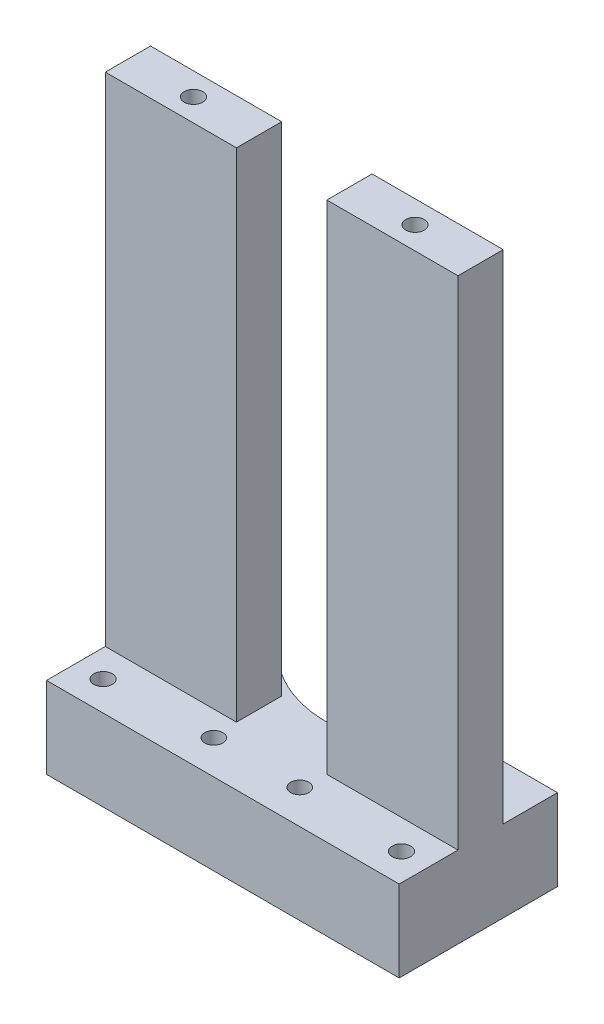
ISO-10303-21;
HEADER;
FILE_DESCRIPTION(('STEP AP214'),'2;1');
FILE_NAME('part.step','',(''),(''),'','','');
FILE_SCHEMA(('AUTOMOTIVE_DESIGN { 1 0 10303 214 1 1 1 1 }'));
ENDSEC;
DATA;
#1=APPLICATION_CONTEXT('core data for automotive mechanical design processes');
#2=APPLICATION_PROTOCOL_DEFINITION('international standard','automotive_design',2000,#1);
#3=PRODUCT_CONTEXT('',#1,'mechanical');
#4=PRODUCT('Part','Part','',(#3));
#5=PRODUCT_RELATED_PRODUCT_CATEGORY('part','',(#4));
#6=PRODUCT_DEFINITION_FORMATION('','',#4);
#7=PRODUCT_DEFINITION_CONTEXT('part definition',#1,'design');
#8=PRODUCT_DEFINITION('design','',#6,#7);
#9=PRODUCT_DEFINITION_SHAPE('','',#8);
#10=(LENGTH_UNIT() NAMED_UNIT(*) SI_UNIT(.MILLI.,.METRE.));
#11=(NAMED_UNIT(*) PLANE_ANGLE_UNIT() SI_UNIT($,.RADIAN.));
#12=(NAMED_UNIT(*) SI_UNIT($,.STERADIAN.) SOLID_ANGLE_UNIT());
#13=UNCERTAINTY_MEASURE_WITH_UNIT(LENGTH_MEASURE(1.E-05),#10,'distance_accuracy_value','');
#14=(GEOMETRIC_REPRESENTATION_CONTEXT(3) GLOBAL_UNCERTAINTY_ASSIGNED_CONTEXT((#13)) GLOBAL_UNIT_ASSIGNED_CONTEXT((#10,
#11,#12)) REPRESENTATION_CONTEXT('',''));
#15=CARTESIAN_POINT('',(0.,0.,0.));
#16=DIRECTION('',(0.,0.,1.));
#17=DIRECTION('',(1.,0.,0.));
#18=AXIS2_PLACEMENT_3D('',#15,#16,#17);
#19=CARTESIAN_POINT('',(0.,18.,-29.1666666666667));
#20=DIRECTION('',(0.,1.,0.));
#21=DIRECTION('',(0.,0.,1.));
#22=AXIS2_PLACEMENT_3D('',#19,#20,#21);
#23=PLANE('',#22);
#24=CARTESIAN_POINT('',(-33.,18.,13.5));
#25=DIRECTION('',(0.,1.,0.));
#26=DIRECTION('',(0.,0.,1.));
#27=AXIS2_PLACEMENT_3D('',#24,#25,#26);
#28=CIRCLE('',#27,2.05);
#29=CARTESIAN_POINT('',(-33.,18.,15.55));
#30=VERTEX_POINT('',#29);
#31=EDGE_CURVE('E271',#30,#30,#28,.T.);
#32=ORIENTED_EDGE('',*,*,#31,.F.);
#33=EDGE_LOOP('',(#32));
#34=FACE_BOUND('',#33,.T.);
#35=CARTESIAN_POINT('',(33.0000000000001,18.,13.4999999999998));
#36=DIRECTION('',(0.,1.,0.));
#37=DIRECTION('',(0.,0.,-1.));
#38=AXIS2_PLACEMENT_3D('',#35,#36,#37);
#39=CIRCLE('',#38,2.05);
#40=CARTESIAN_POINT('',(33.0000000000001,18.,11.4499999999998));
#41=VERTEX_POINT('',#40);
#42=EDGE_CURVE('E257',#41,#41,#39,.T.);
#43=ORIENTED_EDGE('',*,*,#42,.F.);
#44=EDGE_LOOP('',(#43));
#45=FACE_BOUND('',#44,.T.);
#46=CARTESIAN_POINT('',(29.,18.,-8.));
#47=DIRECTION('',(0.,1.,0.));
#48=DIRECTION('',(0.,0.,1.));
#49=AXIS2_PLACEMENT_3D('',#46,#47,#48);
#50=CIRCLE('',#49,2.);
#51=CARTESIAN_POINT('',(29.,18.,-6.));
#52=VERTEX_POINT('',#51);
#53=EDGE_CURVE('E345',#52,#52,#50,.T.);
#54=ORIENTED_EDGE('',*,*,#53,.F.);
#55=EDGE_LOOP('',(#54));
#56=FACE_BOUND('',#55,.T.);
#57=CARTESIAN_POINT('',(-29.,18.,-8.));
#58=DIRECTION('',(0.,1.,0.));
#59=DIRECTION('',(0.,0.,1.));
#60=AXIS2_PLACEMENT_3D('',#57,#58,#59);
#61=CIRCLE('',#60,2.);
#62=CARTESIAN_POINT('',(-29.,18.,-6.));
#63=VERTEX_POINT('',#62);
#64=EDGE_CURVE('E357',#63,#63,#61,.T.);
#65=ORIENTED_EDGE('',*,*,#64,.F.);
#66=EDGE_LOOP('',(#65));
#67=FACE_BOUND('',#66,.T.);
#68=CARTESIAN_POINT('',(-9.50000000000001,18.,12.5));
#69=DIRECTION('',(0.,1.,0.));
#70=DIRECTION('',(0.,0.,1.));
#71=AXIS2_PLACEMENT_3D('',#68,#69,#70);
#72=CIRCLE('',#71,2.);
#73=CARTESIAN_POINT('',(-9.50000000000001,18.,14.5));
#74=VERTEX_POINT('',#73);
#75=EDGE_CURVE('E351',#74,#74,#72,.T.);
#76=ORIENTED_EDGE('',*,*,#75,.F.);
#77=EDGE_LOOP('',(#76));
#78=FACE_BOUND('',#77,.T.);
#79=CARTESIAN_POINT('',(9.49999999999999,18.,12.5));
#80=DIRECTION('',(0.,1.,0.));
#81=DIRECTION('',(0.,0.,1.));
#82=AXIS2_PLACEMENT_3D('',#79,#80,#81);
#83=CIRCLE('',#82,2.);
#84=CARTESIAN_POINT('',(9.49999999999999,18.,14.5));
#85=VERTEX_POINT('',#84);
#86=EDGE_CURVE('E339',#85,#85,#83,.T.);
#87=ORIENTED_EDGE('',*,*,#86,.F.);
#88=EDGE_LOOP('',(#87));
#89=FACE_BOUND('',#88,.T.);
#90=DIRECTION('',(0.,0.,-1.));
#91=VECTOR('',#90,1.);
#92=CARTESIAN_POINT('',(39.,18.,-15.));
#93=LINE('',#92,#91);
#94=CARTESIAN_POINT('',(39.,18.,20.));
#95=VERTEX_POINT('',#94);
#96=CARTESIAN_POINT('',(39.,18.,6.99999999999995));
#97=VERTEX_POINT('',#96);
#98=EDGE_CURVE('E377',#95,#97,#93,.T.);
#99=ORIENTED_EDGE('',*,*,#98,.T.);
#100=DIRECTION('',(1.,0.,0.));
#101=VECTOR('',#100,1.);
#102=CARTESIAN_POINT('',(10.,18.,6.99999999999995));
#103=LINE('',#102,#101);
#104=CARTESIAN_POINT('',(10.,18.,6.99999999999995));
#105=VERTEX_POINT('',#104);
#106=EDGE_CURVE('E292',#105,#97,#103,.T.);
#107=ORIENTED_EDGE('',*,*,#106,.F.);
#108=DIRECTION('',(0.,0.,1.));
#109=VECTOR('',#108,1.);
#110=CARTESIAN_POINT('',(9.99999999999998,18.,-3.00000000000005));
#111=LINE('',#110,#109);
#112=CARTESIAN_POINT('',(9.99999999999998,18.,-3.00000000000005));
#113=VERTEX_POINT('',#112);
#114=EDGE_CURVE('E270',#113,#105,#111,.T.);
#115=ORIENTED_EDGE('',*,*,#114,.F.);
#116=DIRECTION('',(-1.,0.,0.));
#117=VECTOR('',#116,1.);
#118=CARTESIAN_POINT('',(39.,18.,-3.00000000000019));
#119=LINE('',#118,#117);
#120=CARTESIAN_POINT('',(39.,18.,-3.00000000000019));
#121=VERTEX_POINT('',#120);
#122=EDGE_CURVE('E283',#121,#113,#119,.T.);
#123=ORIENTED_EDGE('',*,*,#122,.F.);
#124=CARTESIAN_POINT('',(39.,18.,-15.));
#125=VERTEX_POINT('',#124);
#126=EDGE_CURVE('E376',#121,#125,#93,.T.);
#127=ORIENTED_EDGE('',*,*,#126,.T.);
#128=DIRECTION('',(-1.,0.,0.));
#129=VECTOR('',#128,1.);
#130=CARTESIAN_POINT('',(22.,18.,-15.));
#131=LINE('',#130,#129);
#132=CARTESIAN_POINT('',(22.,18.,-15.));
#133=VERTEX_POINT('',#132);
#134=EDGE_CURVE('E363',#125,#133,#131,.T.);
#135=ORIENTED_EDGE('',*,*,#134,.T.);
#136=CARTESIAN_POINT('',(0.,18.,-29.1666666666667));
#137=DIRECTION('',(0.,-1.,0.));
#138=DIRECTION('',(0.,0.,1.));
#139=AXIS2_PLACEMENT_3D('',#136,#137,#138);
#140=CIRCLE('',#139,26.1666666666667);
#141=CARTESIAN_POINT('',(-22.,18.,-15.));
#142=VERTEX_POINT('',#141);
#143=EDGE_CURVE('E366',#133,#142,#140,.T.);
#144=ORIENTED_EDGE('',*,*,#143,.T.);
#145=DIRECTION('',(-1.,0.,0.));
#146=VECTOR('',#145,1.);
#147=CARTESIAN_POINT('',(-39.,18.,-15.));
#148=LINE('',#147,#146);
#149=CARTESIAN_POINT('',(-39.,18.,-15.));
#150=VERTEX_POINT('',#149);
#151=EDGE_CURVE('E369',#142,#150,#148,.T.);
#152=ORIENTED_EDGE('',*,*,#151,.T.);
#153=DIRECTION('',(0.,0.,1.));
#154=VECTOR('',#153,1.);
#155=CARTESIAN_POINT('',(-39.,18.,-15.));
#156=LINE('',#155,#154);
#157=CARTESIAN_POINT('',(-39.,18.,-3.));
#158=VERTEX_POINT('',#157);
#159=EDGE_CURVE('E372',#150,#158,#156,.T.);
#160=ORIENTED_EDGE('',*,*,#159,.T.);
#161=DIRECTION('',(-1.,0.,0.));
#162=VECTOR('',#161,1.);
#163=CARTESIAN_POINT('',(-39.,18.,-3.));
#164=LINE('',#163,#162);
#165=CARTESIAN_POINT('',(-10.,18.,-3.));
#166=VERTEX_POINT('',#165);
#167=EDGE_CURVE('E313',#166,#158,#164,.T.);
#168=ORIENTED_EDGE('',*,*,#167,.F.);
#169=DIRECTION('',(0.,0.,-1.));
#170=VECTOR('',#169,1.);
#171=CARTESIAN_POINT('',(-10.,18.,-3.));
#172=LINE('',#171,#170);
#173=CARTESIAN_POINT('',(-10.,18.,7.));
#174=VERTEX_POINT('',#173);
#175=EDGE_CURVE('E322',#174,#166,#172,.T.);
#176=ORIENTED_EDGE('',*,*,#175,.F.);
#177=DIRECTION('',(1.,0.,0.));
#178=VECTOR('',#177,1.);
#179=CARTESIAN_POINT('',(-10.,18.,7.));
#180=LINE('',#179,#178);
#181=CARTESIAN_POINT('',(-39.,18.,7.));
#182=VERTEX_POINT('',#181);
#183=EDGE_CURVE('E308',#182,#174,#180,.T.);
#184=ORIENTED_EDGE('',*,*,#183,.F.);
#185=CARTESIAN_POINT('',(-39.,18.,20.));
#186=VERTEX_POINT('',#185);
#187=EDGE_CURVE('E371',#182,#186,#156,.T.);
#188=ORIENTED_EDGE('',*,*,#187,.T.);
#189=DIRECTION('',(1.,0.,0.));
#190=VECTOR('',#189,1.);
#191=CARTESIAN_POINT('',(-39.,18.,20.));
#192=LINE('',#191,#190);
#193=EDGE_CURVE('E374',#186,#95,#192,.T.);
#194=ORIENTED_EDGE('',*,*,#193,.T.);
#195=EDGE_LOOP('',(#99,#107,#115,#123,#127,#135,#144,#152,#160,#168,#176,#184,#188,#194));
#196=FACE_BOUND('',#195,.T.);
#197=ADVANCED_FACE('F33',(#34,#45,#56,#67,#78,#89,#196),#23,.T.);
#198=CARTESIAN_POINT('',(0.,0.,-29.1666666666667));
#199=DIRECTION('',(0.,1.,0.));
#200=DIRECTION('',(0.,0.,1.));
#201=AXIS2_PLACEMENT_3D('',#198,#199,#200);
#202=PLANE('',#201);
#203=DIRECTION('',(-1.,0.,0.));
#204=VECTOR('',#203,1.);
#205=CARTESIAN_POINT('',(22.,0.,-15.));
#206=LINE('',#205,#204);
#207=CARTESIAN_POINT('',(39.,0.,-15.));
#208=VERTEX_POINT('',#207);
#209=CARTESIAN_POINT('',(22.,0.,-15.));
#210=VERTEX_POINT('',#209);
#211=EDGE_CURVE('E360',#208,#210,#206,.T.);
#212=ORIENTED_EDGE('',*,*,#211,.F.);
#213=DIRECTION('',(0.,0.,-1.));
#214=VECTOR('',#213,1.);
#215=CARTESIAN_POINT('',(39.,0.,-15.));
#216=LINE('',#215,#214);
#217=CARTESIAN_POINT('',(39.,0.,20.));
#218=VERTEX_POINT('',#217);
#219=EDGE_CURVE('E367',#218,#208,#216,.T.);
#220=ORIENTED_EDGE('',*,*,#219,.F.);
#221=DIRECTION('',(1.,0.,0.));
#222=VECTOR('',#221,1.);
#223=CARTESIAN_POINT('',(-39.,0.,20.));
#224=LINE('',#223,#222);
#225=CARTESIAN_POINT('',(-39.,0.,20.));
#226=VERTEX_POINT('',#225);
#227=EDGE_CURVE('E388',#226,#218,#224,.T.);
#228=ORIENTED_EDGE('',*,*,#227,.F.);
#229=DIRECTION('',(0.,0.,1.));
#230=VECTOR('',#229,1.);
#231=CARTESIAN_POINT('',(-39.,0.,-15.));
#232=LINE('',#231,#230);
#233=CARTESIAN_POINT('',(-39.,0.,-15.));
#234=VERTEX_POINT('',#233);
#235=EDGE_CURVE('E386',#234,#226,#232,.T.);
#236=ORIENTED_EDGE('',*,*,#235,.F.);
#237=DIRECTION('',(-1.,0.,0.));
#238=VECTOR('',#237,1.);
#239=CARTESIAN_POINT('',(-39.,0.,-15.));
#240=LINE('',#239,#238);
#241=CARTESIAN_POINT('',(-22.,0.,-15.));
#242=VERTEX_POINT('',#241);
#243=EDGE_CURVE('E384',#242,#234,#240,.T.);
#244=ORIENTED_EDGE('',*,*,#243,.F.);
#245=CARTESIAN_POINT('',(0.,0.,-29.1666666666667));
#246=DIRECTION('',(0.,-1.,0.));
#247=DIRECTION('',(0.,0.,1.));
#248=AXIS2_PLACEMENT_3D('',#245,#246,#247);
#249=CIRCLE('',#248,26.1666666666667);
#250=EDGE_CURVE('E382',#210,#242,#249,.T.);
#251=ORIENTED_EDGE('',*,*,#250,.F.);
#252=EDGE_LOOP('',(#212,#220,#228,#236,#244,#251));
#253=FACE_BOUND('',#252,.T.);
#254=CARTESIAN_POINT('',(-29.,0.,-8.));
#255=DIRECTION('',(0.,1.,0.));
#256=DIRECTION('',(0.,0.,1.));
#257=AXIS2_PLACEMENT_3D('',#254,#255,#256);
#258=CIRCLE('',#257,2.);
#259=CARTESIAN_POINT('',(-29.,0.,-6.));
#260=VERTEX_POINT('',#259);
#261=EDGE_CURVE('E354',#260,#260,#258,.T.);
#262=ORIENTED_EDGE('',*,*,#261,.T.);
#263=EDGE_LOOP('',(#262));
#264=FACE_BOUND('',#263,.T.);
#265=CARTESIAN_POINT('',(-9.50000000000001,0.,12.5));
#266=DIRECTION('',(0.,1.,0.));
#267=DIRECTION('',(0.,0.,1.));
#268=AXIS2_PLACEMENT_3D('',#265,#266,#267);
#269=CIRCLE('',#268,2.);
#270=CARTESIAN_POINT('',(-9.50000000000001,0.,14.5));
#271=VERTEX_POINT('',#270);
#272=EDGE_CURVE('E348',#271,#271,#269,.T.);
#273=ORIENTED_EDGE('',*,*,#272,.T.);
#274=EDGE_LOOP('',(#273));
#275=FACE_BOUND('',#274,.T.);
#276=CARTESIAN_POINT('',(29.,0.,-8.));
#277=DIRECTION('',(0.,1.,0.));
#278=DIRECTION('',(0.,0.,1.));
#279=AXIS2_PLACEMENT_3D('',#276,#277,#278);
#280=CIRCLE('',#279,2.);
#281=CARTESIAN_POINT('',(29.,0.,-6.));
#282=VERTEX_POINT('',#281);
#283=EDGE_CURVE('E342',#282,#282,#280,.T.);
#284=ORIENTED_EDGE('',*,*,#283,.T.);
#285=EDGE_LOOP('',(#284));
#286=FACE_BOUND('',#285,.T.);
#287=CARTESIAN_POINT('',(9.49999999999999,0.,12.5));
#288=DIRECTION('',(0.,1.,0.));
#289=DIRECTION('',(0.,0.,1.));
#290=AXIS2_PLACEMENT_3D('',#287,#288,#289);
#291=CIRCLE('',#290,2.);
#292=CARTESIAN_POINT('',(9.49999999999999,0.,14.5));
#293=VERTEX_POINT('',#292);
#294=EDGE_CURVE('E338',#293,#293,#291,.T.);
#295=ORIENTED_EDGE('',*,*,#294,.T.);
#296=EDGE_LOOP('',(#295));
#297=FACE_BOUND('',#296,.T.);
#298=ADVANCED_FACE('F438',(#253,#264,#275,#286,#297),#202,.F.);
#299=CARTESIAN_POINT('',(22.,18.,-15.));
#300=DIRECTION('',(0.,0.,1.));
#301=DIRECTION('',(1.,0.,0.));
#302=AXIS2_PLACEMENT_3D('',#299,#300,#301);
#303=PLANE('',#302);
#304=ORIENTED_EDGE('',*,*,#211,.T.);
#305=DIRECTION('',(0.,-1.,0.));
#306=VECTOR('',#305,1.);
#307=CARTESIAN_POINT('',(22.,18.,-15.));
#308=LINE('',#307,#306);
#309=EDGE_CURVE('E11',#133,#210,#308,.T.);
#310=ORIENTED_EDGE('',*,*,#309,.F.);
#311=ORIENTED_EDGE('',*,*,#134,.F.);
#312=DIRECTION('',(0.,-1.,0.));
#313=VECTOR('',#312,1.);
#314=CARTESIAN_POINT('',(39.,18.,-15.));
#315=LINE('',#314,#313);
#316=EDGE_CURVE('E379',#125,#208,#315,.T.);
#317=ORIENTED_EDGE('',*,*,#316,.T.);
#318=EDGE_LOOP('',(#304,#310,#311,#317));
#319=FACE_BOUND('',#318,.T.);
#320=ADVANCED_FACE('F35',(#319),#303,.F.);
#321=CARTESIAN_POINT('',(0.,18.,-29.1666666666667));
#322=DIRECTION('',(0.,-1.,0.));
#323=DIRECTION('',(0.,0.,-1.));
#324=AXIS2_PLACEMENT_3D('',#321,#322,#323);
#325=CYLINDRICAL_SURFACE('',#324,26.1666666666667);
#326=ORIENTED_EDGE('',*,*,#250,.T.);
#327=DIRECTION('',(0.,-1.,0.));
#328=VECTOR('',#327,1.);
#329=CARTESIAN_POINT('',(-22.,18.,-15.));
#330=LINE('',#329,#328);
#331=EDGE_CURVE('E42',#142,#242,#330,.T.);
#332=ORIENTED_EDGE('',*,*,#331,.F.);
#333=ORIENTED_EDGE('',*,*,#143,.F.);
#334=ORIENTED_EDGE('',*,*,#309,.T.);
#335=EDGE_LOOP('',(#326,#332,#333,#334));
#336=FACE_BOUND('',#335,.T.);
#337=ADVANCED_FACE('F466',(#336),#325,.F.);
#338=CARTESIAN_POINT('',(-39.,18.,-15.));
#339=DIRECTION('',(0.,0.,1.));
#340=DIRECTION('',(1.,0.,0.));
#341=AXIS2_PLACEMENT_3D('',#338,#339,#340);
#342=PLANE('',#341);
#343=ORIENTED_EDGE('',*,*,#243,.T.);
#344=DIRECTION('',(0.,-1.,0.));
#345=VECTOR('',#344,1.);
#346=CARTESIAN_POINT('',(-39.,18.,-15.));
#347=LINE('',#346,#345);
#348=EDGE_CURVE('E399',#150,#234,#347,.T.);
#349=ORIENTED_EDGE('',*,*,#348,.F.);
#350=ORIENTED_EDGE('',*,*,#151,.F.);
#351=ORIENTED_EDGE('',*,*,#331,.T.);
#352=EDGE_LOOP('',(#343,#349,#350,#351));
#353=FACE_BOUND('',#352,.T.);
#354=ADVANCED_FACE('F463',(#353),#342,.F.);
#355=CARTESIAN_POINT('',(-39.,18.,-15.));
#356=DIRECTION('',(1.,0.,0.));
#357=DIRECTION('',(0.,0.,-1.));
#358=AXIS2_PLACEMENT_3D('',#355,#356,#357);
#359=PLANE('',#358);
#360=ORIENTED_EDGE('',*,*,#235,.T.);
#361=DIRECTION('',(0.,-1.,0.));
#362=VECTOR('',#361,1.);
#363=CARTESIAN_POINT('',(-39.,18.,20.));
#364=LINE('',#363,#362);
#365=EDGE_CURVE('E396',#186,#226,#364,.T.);
#366=ORIENTED_EDGE('',*,*,#365,.F.);
#367=ORIENTED_EDGE('',*,*,#187,.F.);
#368=DIRECTION('',(0.,-1.,0.));
#369=VECTOR('',#368,1.);
#370=CARTESIAN_POINT('',(-39.,128.,7.));
#371=LINE('',#370,#369);
#372=CARTESIAN_POINT('',(-39.,128.,7.));
#373=VERTEX_POINT('',#372);
#374=EDGE_CURVE('E335',#373,#182,#371,.T.);
#375=ORIENTED_EDGE('',*,*,#374,.F.);
#376=DIRECTION('',(0.,0.,1.));
#377=VECTOR('',#376,1.);
#378=CARTESIAN_POINT('',(-39.,128.,-3.));
#379=LINE('',#378,#377);
#380=CARTESIAN_POINT('',(-39.,128.,-3.));
#381=VERTEX_POINT('',#380);
#382=EDGE_CURVE('E309',#381,#373,#379,.T.);
#383=ORIENTED_EDGE('',*,*,#382,.F.);
#384=DIRECTION('',(0.,-1.,0.));
#385=VECTOR('',#384,1.);
#386=CARTESIAN_POINT('',(-39.,128.,-3.));
#387=LINE('',#386,#385);
#388=EDGE_CURVE('E319',#381,#158,#387,.T.);
#389=ORIENTED_EDGE('',*,*,#388,.T.);
#390=ORIENTED_EDGE('',*,*,#159,.F.);
#391=ORIENTED_EDGE('',*,*,#348,.T.);
#392=EDGE_LOOP('',(#360,#366,#367,#375,#383,#389,#390,#391));
#393=FACE_BOUND('',#392,.T.);
#394=ADVANCED_FACE('F459',(#393),#359,.F.);
#395=CARTESIAN_POINT('',(-39.,18.,20.));
#396=DIRECTION('',(0.,0.,-1.));
#397=DIRECTION('',(-1.,0.,0.));
#398=AXIS2_PLACEMENT_3D('',#395,#396,#397);
#399=PLANE('',#398);
#400=ORIENTED_EDGE('',*,*,#227,.T.);
#401=DIRECTION('',(0.,-1.,0.));
#402=VECTOR('',#401,1.);
#403=CARTESIAN_POINT('',(39.,18.,20.));
#404=LINE('',#403,#402);
#405=EDGE_CURVE('E393',#95,#218,#404,.T.);
#406=ORIENTED_EDGE('',*,*,#405,.F.);
#407=ORIENTED_EDGE('',*,*,#193,.F.);
#408=ORIENTED_EDGE('',*,*,#365,.T.);
#409=EDGE_LOOP('',(#400,#406,#407,#408));
#410=FACE_BOUND('',#409,.T.);
#411=ADVANCED_FACE('F455',(#410),#399,.F.);
#412=CARTESIAN_POINT('',(39.,18.,-15.));
#413=DIRECTION('',(-1.,0.,0.));
#414=DIRECTION('',(0.,0.,1.));
#415=AXIS2_PLACEMENT_3D('',#412,#413,#414);
#416=PLANE('',#415);
#417=ORIENTED_EDGE('',*,*,#219,.T.);
#418=ORIENTED_EDGE('',*,*,#316,.F.);
#419=ORIENTED_EDGE('',*,*,#126,.F.);
#420=DIRECTION('',(0.,-1.,0.));
#421=VECTOR('',#420,1.);
#422=CARTESIAN_POINT('',(39.,128.,-3.00000000000019));
#423=LINE('',#422,#421);
#424=CARTESIAN_POINT('',(39.,128.,-3.00000000000019));
#425=VERTEX_POINT('',#424);
#426=EDGE_CURVE('E299',#425,#121,#423,.T.);
#427=ORIENTED_EDGE('',*,*,#426,.F.);
#428=DIRECTION('',(0.,0.,-1.));
#429=VECTOR('',#428,1.);
#430=CARTESIAN_POINT('',(39.,128.,-3.00000000000019));
#431=LINE('',#430,#429);
#432=CARTESIAN_POINT('',(39.,128.,6.99999999999981));
#433=VERTEX_POINT('',#432);
#434=EDGE_CURVE('E285',#433,#425,#431,.T.);
#435=ORIENTED_EDGE('',*,*,#434,.F.);
#436=DIRECTION('',(0.,-1.,0.));
#437=VECTOR('',#436,1.);
#438=CARTESIAN_POINT('',(39.,128.,6.99999999999981));
#439=LINE('',#438,#437);
#440=EDGE_CURVE('E302',#433,#97,#439,.T.);
#441=ORIENTED_EDGE('',*,*,#440,.T.);
#442=ORIENTED_EDGE('',*,*,#98,.F.);
#443=ORIENTED_EDGE('',*,*,#405,.T.);
#444=EDGE_LOOP('',(#417,#418,#419,#427,#435,#441,#442,#443));
#445=FACE_BOUND('',#444,.T.);
#446=ADVANCED_FACE('F452',(#445),#416,.F.);
#447=CARTESIAN_POINT('',(-29.,18.,-8.));
#448=DIRECTION('',(0.,-1.,0.));
#449=DIRECTION('',(0.,0.,-1.));
#450=AXIS2_PLACEMENT_3D('',#447,#448,#449);
#451=CYLINDRICAL_SURFACE('',#450,2.);
#452=ORIENTED_EDGE('',*,*,#64,.T.);
#453=EDGE_LOOP('',(#452));
#454=FACE_BOUND('',#453,.T.);
#455=ORIENTED_EDGE('',*,*,#261,.F.);
#456=EDGE_LOOP('',(#455));
#457=FACE_BOUND('',#456,.T.);
#458=ADVANCED_FACE('F449',(#454,#457),#451,.F.);
#459=CARTESIAN_POINT('',(-9.50000000000001,18.,12.5));
#460=DIRECTION('',(0.,-1.,0.));
#461=DIRECTION('',(0.,0.,-1.));
#462=AXIS2_PLACEMENT_3D('',#459,#460,#461);
#463=CYLINDRICAL_SURFACE('',#462,2.);
#464=ORIENTED_EDGE('',*,*,#75,.T.);
#465=EDGE_LOOP('',(#464));
#466=FACE_BOUND('',#465,.T.);
#467=ORIENTED_EDGE('',*,*,#272,.F.);
#468=EDGE_LOOP('',(#467));
#469=FACE_BOUND('',#468,.T.);
#470=ADVANCED_FACE('F524',(#466,#469),#463,.F.);
#471=CARTESIAN_POINT('',(29.,18.,-8.));
#472=DIRECTION('',(0.,-1.,0.));
#473=DIRECTION('',(0.,0.,-1.));
#474=AXIS2_PLACEMENT_3D('',#471,#472,#473);
#475=CYLINDRICAL_SURFACE('',#474,2.);
#476=ORIENTED_EDGE('',*,*,#53,.T.);
#477=EDGE_LOOP('',(#476));
#478=FACE_BOUND('',#477,.T.);
#479=ORIENTED_EDGE('',*,*,#283,.F.);
#480=EDGE_LOOP('',(#479));
#481=FACE_BOUND('',#480,.T.);
#482=ADVANCED_FACE('F521',(#478,#481),#475,.F.);
#483=CARTESIAN_POINT('',(9.49999999999999,18.,12.5));
#484=DIRECTION('',(0.,-1.,0.));
#485=DIRECTION('',(0.,0.,-1.));
#486=AXIS2_PLACEMENT_3D('',#483,#484,#485);
#487=CYLINDRICAL_SURFACE('',#486,2.);
#488=ORIENTED_EDGE('',*,*,#86,.T.);
#489=EDGE_LOOP('',(#488));
#490=FACE_BOUND('',#489,.T.);
#491=ORIENTED_EDGE('',*,*,#294,.F.);
#492=EDGE_LOOP('',(#491));
#493=FACE_BOUND('',#492,.T.);
#494=ADVANCED_FACE('F515',(#490,#493),#487,.F.);
#495=CARTESIAN_POINT('',(-10.,128.,7.));
#496=DIRECTION('',(0.,0.,-1.));
#497=DIRECTION('',(-1.,0.,0.));
#498=AXIS2_PLACEMENT_3D('',#495,#496,#497);
#499=PLANE('',#498);
#500=ORIENTED_EDGE('',*,*,#183,.T.);
#501=DIRECTION('',(0.,-1.,0.));
#502=VECTOR('',#501,1.);
#503=CARTESIAN_POINT('',(-10.,128.,7.));
#504=LINE('',#503,#502);
#505=CARTESIAN_POINT('',(-10.,128.,7.));
#506=VERTEX_POINT('',#505);
#507=EDGE_CURVE('E332',#506,#174,#504,.T.);
#508=ORIENTED_EDGE('',*,*,#507,.F.);
#509=DIRECTION('',(1.,0.,0.));
#510=VECTOR('',#509,1.);
#511=CARTESIAN_POINT('',(-10.,128.,7.));
#512=LINE('',#511,#510);
#513=EDGE_CURVE('E312',#373,#506,#512,.T.);
#514=ORIENTED_EDGE('',*,*,#513,.F.);
#515=ORIENTED_EDGE('',*,*,#374,.T.);
#516=EDGE_LOOP('',(#500,#508,#514,#515));
#517=FACE_BOUND('',#516,.T.);
#518=ADVANCED_FACE('F494',(#517),#499,.F.);
#519=CARTESIAN_POINT('',(-10.,128.,-3.));
#520=DIRECTION('',(-1.,0.,0.));
#521=DIRECTION('',(0.,0.,1.));
#522=AXIS2_PLACEMENT_3D('',#519,#520,#521);
#523=PLANE('',#522);
#524=ORIENTED_EDGE('',*,*,#175,.T.);
#525=DIRECTION('',(0.,-1.,0.));
#526=VECTOR('',#525,1.);
#527=CARTESIAN_POINT('',(-10.,128.,-3.));
#528=LINE('',#527,#526);
#529=CARTESIAN_POINT('',(-10.,128.,-3.));
#530=VERTEX_POINT('',#529);
#531=EDGE_CURVE('E329',#530,#166,#528,.T.);
#532=ORIENTED_EDGE('',*,*,#531,.F.);
#533=DIRECTION('',(0.,0.,-1.));
#534=VECTOR('',#533,1.);
#535=CARTESIAN_POINT('',(-10.,128.,-3.));
#536=LINE('',#535,#534);
#537=EDGE_CURVE('E315',#506,#530,#536,.T.);
#538=ORIENTED_EDGE('',*,*,#537,.F.);
#539=ORIENTED_EDGE('',*,*,#507,.T.);
#540=EDGE_LOOP('',(#524,#532,#538,#539));
#541=FACE_BOUND('',#540,.T.);
#542=ADVANCED_FACE('F505',(#541),#523,.F.);
#543=CARTESIAN_POINT('',(-39.,128.,-3.));
#544=DIRECTION('',(0.,0.,1.));
#545=DIRECTION('',(1.,0.,0.));
#546=AXIS2_PLACEMENT_3D('',#543,#544,#545);
#547=PLANE('',#546);
#548=DIRECTION('',(1.,0.,0.));
#549=VECTOR('',#548,1.);
#550=CARTESIAN_POINT('',(-21.5,109.5,-3.));
#551=LINE('',#550,#549);
#552=CARTESIAN_POINT('',(-27.5,109.5,-3.));
#553=VERTEX_POINT('',#552);
#554=CARTESIAN_POINT('',(-21.5,109.5,-3.));
#555=VERTEX_POINT('',#554);
#556=EDGE_CURVE('E214',#553,#555,#551,.T.);
#557=ORIENTED_EDGE('',*,*,#556,.F.);
#558=DIRECTION('',(0.,1.,0.));
#559=VECTOR('',#558,1.);
#560=CARTESIAN_POINT('',(-27.5,109.5,-3.));
#561=LINE('',#560,#559);
#562=CARTESIAN_POINT('',(-27.5,106.5,-3.));
#563=VERTEX_POINT('',#562);
#564=EDGE_CURVE('E50',#563,#553,#561,.T.);
#565=ORIENTED_EDGE('',*,*,#564,.F.);
#566=DIRECTION('',(-1.,0.,0.));
#567=VECTOR('',#566,1.);
#568=CARTESIAN_POINT('',(-21.5,106.5,-3.));
#569=LINE('',#568,#567);
#570=CARTESIAN_POINT('',(-21.5,106.5,-3.));
#571=VERTEX_POINT('',#570);
#572=EDGE_CURVE('E205',#571,#563,#569,.T.);
#573=ORIENTED_EDGE('',*,*,#572,.F.);
#574=DIRECTION('',(0.,-1.,0.));
#575=VECTOR('',#574,1.);
#576=CARTESIAN_POINT('',(-21.5,109.5,-3.));
#577=LINE('',#576,#575);
#578=EDGE_CURVE('E208',#555,#571,#577,.T.);
#579=ORIENTED_EDGE('',*,*,#578,.F.);
#580=EDGE_LOOP('',(#557,#565,#573,#579));
#581=FACE_BOUND('',#580,.T.);
#582=ORIENTED_EDGE('',*,*,#167,.T.);
#583=ORIENTED_EDGE('',*,*,#388,.F.);
#584=DIRECTION('',(-1.,0.,0.));
#585=VECTOR('',#584,1.);
#586=CARTESIAN_POINT('',(-39.,128.,-3.));
#587=LINE('',#586,#585);
#588=EDGE_CURVE('E317',#530,#381,#587,.T.);
#589=ORIENTED_EDGE('',*,*,#588,.F.);
#590=ORIENTED_EDGE('',*,*,#531,.T.);
#591=EDGE_LOOP('',(#582,#583,#589,#590));
#592=FACE_BOUND('',#591,.T.);
#593=ADVANCED_FACE('F502',(#581,#592),#547,.F.);
#594=CARTESIAN_POINT('',(0.,128.,0.));
#595=DIRECTION('',(0.,-1.,0.));
#596=DIRECTION('',(0.,0.,-1.));
#597=AXIS2_PLACEMENT_3D('',#594,#595,#596);
#598=PLANE('',#597);
#599=CARTESIAN_POINT('',(-24.5,128.,2.));
#600=DIRECTION('',(0.,1.,0.));
#601=DIRECTION('',(0.,0.,1.));
#602=AXIS2_PLACEMENT_3D('',#599,#600,#601);
#603=CIRCLE('',#602,2.05);
#604=CARTESIAN_POINT('',(-24.5,128.,4.05));
#605=VERTEX_POINT('',#604);
#606=EDGE_CURVE('E258',#605,#605,#603,.T.);
#607=ORIENTED_EDGE('',*,*,#606,.F.);
#608=EDGE_LOOP('',(#607));
#609=FACE_BOUND('',#608,.T.);
#610=ORIENTED_EDGE('',*,*,#382,.T.);
#611=ORIENTED_EDGE('',*,*,#513,.T.);
#612=ORIENTED_EDGE('',*,*,#537,.T.);
#613=ORIENTED_EDGE('',*,*,#588,.T.);
#614=EDGE_LOOP('',(#610,#611,#612,#613));
#615=FACE_BOUND('',#614,.T.);
#616=ADVANCED_FACE('F498',(#609,#615),#598,.F.);
#617=CARTESIAN_POINT('',(9.99999999999998,128.,-3.00000000000005));
#618=DIRECTION('',(1.,0.,0.));
#619=DIRECTION('',(0.,0.,-1.));
#620=AXIS2_PLACEMENT_3D('',#617,#618,#619);
#621=PLANE('',#620);
#622=ORIENTED_EDGE('',*,*,#114,.T.);
#623=DIRECTION('',(0.,-1.,0.));
#624=VECTOR('',#623,1.);
#625=CARTESIAN_POINT('',(10.,128.,6.99999999999995));
#626=LINE('',#625,#624);
#627=CARTESIAN_POINT('',(10.,128.,6.99999999999995));
#628=VERTEX_POINT('',#627);
#629=EDGE_CURVE('E305',#628,#105,#626,.T.);
#630=ORIENTED_EDGE('',*,*,#629,.F.);
#631=DIRECTION('',(0.,0.,1.));
#632=VECTOR('',#631,1.);
#633=CARTESIAN_POINT('',(9.99999999999998,128.,-3.00000000000005));
#634=LINE('',#633,#632);
#635=CARTESIAN_POINT('',(9.99999999999998,128.,-3.00000000000005));
#636=VERTEX_POINT('',#635);
#637=EDGE_CURVE('E279',#636,#628,#634,.T.);
#638=ORIENTED_EDGE('',*,*,#637,.F.);
#639=DIRECTION('',(0.,-1.,0.));
#640=VECTOR('',#639,1.);
#641=CARTESIAN_POINT('',(9.99999999999998,128.,-3.00000000000005));
#642=LINE('',#641,#640);
#643=EDGE_CURVE('E289',#636,#113,#642,.T.);
#644=ORIENTED_EDGE('',*,*,#643,.T.);
#645=EDGE_LOOP('',(#622,#630,#638,#644));
#646=FACE_BOUND('',#645,.T.);
#647=ADVANCED_FACE('F677',(#646),#621,.F.);
#648=CARTESIAN_POINT('',(10.,128.,6.99999999999995));
#649=DIRECTION('',(0.,0.,-1.));
#650=DIRECTION('',(-1.,0.,0.));
#651=AXIS2_PLACEMENT_3D('',#648,#649,#650);
#652=PLANE('',#651);
#653=ORIENTED_EDGE('',*,*,#106,.T.);
#654=ORIENTED_EDGE('',*,*,#440,.F.);
#655=DIRECTION('',(1.,0.,0.));
#656=VECTOR('',#655,1.);
#657=CARTESIAN_POINT('',(10.,128.,6.99999999999995));
#658=LINE('',#657,#656);
#659=EDGE_CURVE('E282',#628,#433,#658,.T.);
#660=ORIENTED_EDGE('',*,*,#659,.F.);
#661=ORIENTED_EDGE('',*,*,#629,.T.);
#662=EDGE_LOOP('',(#653,#654,#660,#661));
#663=FACE_BOUND('',#662,.T.);
#664=ADVANCED_FACE('F623',(#663),#652,.F.);
#665=CARTESIAN_POINT('',(39.,128.,-3.00000000000019));
#666=DIRECTION('',(0.,0.,1.));
#667=DIRECTION('',(1.,0.,0.));
#668=AXIS2_PLACEMENT_3D('',#665,#666,#667);
#669=PLANE('',#668);
#670=DIRECTION('',(1.,0.,0.));
#671=VECTOR('',#670,1.);
#672=CARTESIAN_POINT('',(21.5000000000001,109.5,-3.));
#673=LINE('',#672,#671);
#674=CARTESIAN_POINT('',(21.5000000000001,109.5,-3.00000000000011));
#675=VERTEX_POINT('',#674);
#676=CARTESIAN_POINT('',(27.5000000000001,109.5,-3.));
#677=VERTEX_POINT('',#676);
#678=EDGE_CURVE('E240',#675,#677,#673,.T.);
#679=ORIENTED_EDGE('',*,*,#678,.F.);
#680=DIRECTION('',(0.,1.,0.));
#681=VECTOR('',#680,1.);
#682=CARTESIAN_POINT('',(21.5000000000001,109.5,-3.));
#683=LINE('',#682,#681);
#684=CARTESIAN_POINT('',(21.5000000000001,106.5,-3.));
#685=VERTEX_POINT('',#684);
#686=EDGE_CURVE('E58',#685,#675,#683,.T.);
#687=ORIENTED_EDGE('',*,*,#686,.F.);
#688=DIRECTION('',(-1.,0.,0.));
#689=VECTOR('',#688,1.);
#690=CARTESIAN_POINT('',(21.5000000000001,106.5,-3.));
#691=LINE('',#690,#689);
#692=CARTESIAN_POINT('',(27.5000000000001,106.5,-3.));
#693=VERTEX_POINT('',#692);
#694=EDGE_CURVE('E229',#693,#685,#691,.T.);
#695=ORIENTED_EDGE('',*,*,#694,.F.);
#696=DIRECTION('',(0.,-1.,0.));
#697=VECTOR('',#696,1.);
#698=CARTESIAN_POINT('',(27.5000000000001,109.5,-3.));
#699=LINE('',#698,#697);
#700=EDGE_CURVE('E243',#677,#693,#699,.T.);
#701=ORIENTED_EDGE('',*,*,#700,.F.);
#702=EDGE_LOOP('',(#679,#687,#695,#701));
#703=FACE_BOUND('',#702,.T.);
#704=ORIENTED_EDGE('',*,*,#122,.T.);
#705=ORIENTED_EDGE('',*,*,#643,.F.);
#706=DIRECTION('',(-1.,0.,0.));
#707=VECTOR('',#706,1.);
#708=CARTESIAN_POINT('',(39.,128.,-3.00000000000019));
#709=LINE('',#708,#707);
#710=EDGE_CURVE('E287',#425,#636,#709,.T.);
#711=ORIENTED_EDGE('',*,*,#710,.F.);
#712=ORIENTED_EDGE('',*,*,#426,.T.);
#713=EDGE_LOOP('',(#704,#705,#711,#712));
#714=FACE_BOUND('',#713,.T.);
#715=ADVANCED_FACE('F684',(#703,#714),#669,.F.);
#716=CARTESIAN_POINT('',(0.,128.,0.));
#717=DIRECTION('',(0.,1.,0.));
#718=DIRECTION('',(0.,0.,1.));
#719=AXIS2_PLACEMENT_3D('',#716,#717,#718);
#720=PLANE('',#719);
#721=CARTESIAN_POINT('',(24.5,128.,1.99999999999991));
#722=DIRECTION('',(0.,1.,0.));
#723=DIRECTION('',(0.,0.,-1.));
#724=AXIS2_PLACEMENT_3D('',#721,#722,#723);
#725=CIRCLE('',#724,2.05000000000001);
#726=CARTESIAN_POINT('',(24.5,128.,-0.0500000000000916));
#727=VERTEX_POINT('',#726);
#728=EDGE_CURVE('E264',#727,#727,#725,.T.);
#729=ORIENTED_EDGE('',*,*,#728,.F.);
#730=EDGE_LOOP('',(#729));
#731=FACE_BOUND('',#730,.T.);
#732=ORIENTED_EDGE('',*,*,#637,.T.);
#733=ORIENTED_EDGE('',*,*,#659,.T.);
#734=ORIENTED_EDGE('',*,*,#434,.T.);
#735=ORIENTED_EDGE('',*,*,#710,.T.);
#736=EDGE_LOOP('',(#732,#733,#734,#735));
#737=FACE_BOUND('',#736,.T.);
#738=ADVANCED_FACE('F634',(#731,#737),#720,.T.);
#739=CARTESIAN_POINT('',(33.0000000000001,12.,13.4999999999998));
#740=DIRECTION('',(0.,1.,0.));
#741=DIRECTION('',(0.,0.,1.));
#742=AXIS2_PLACEMENT_3D('',#739,#740,#741);
#743=CYLINDRICAL_SURFACE('',#742,2.05);
#744=CARTESIAN_POINT('',(33.0000000000001,12.,13.4999999999998));
#745=DIRECTION('',(0.,1.,0.));
#746=DIRECTION('',(0.,0.,-1.));
#747=AXIS2_PLACEMENT_3D('',#744,#745,#746);
#748=CIRCLE('',#747,2.05);
#749=CARTESIAN_POINT('',(33.0000000000001,12.,11.4499999999998));
#750=VERTEX_POINT('',#749);
#751=EDGE_CURVE('E274',#750,#750,#748,.T.);
#752=ORIENTED_EDGE('',*,*,#751,.F.);
#753=EDGE_LOOP('',(#752));
#754=FACE_BOUND('',#753,.T.);
#755=ORIENTED_EDGE('',*,*,#42,.T.);
#756=EDGE_LOOP('',(#755));
#757=FACE_BOUND('',#756,.T.);
#758=ADVANCED_FACE('F628',(#754,#757),#743,.F.);
#759=CARTESIAN_POINT('',(33.0000000000001,12.,13.4999999999998));
#760=DIRECTION('',(0.,-1.,0.));
#761=DIRECTION('',(0.,0.,-1.));
#762=AXIS2_PLACEMENT_3D('',#759,#760,#761);
#763=PLANE('',#762);
#764=ORIENTED_EDGE('',*,*,#751,.T.);
#765=EDGE_LOOP('',(#764));
#766=FACE_BOUND('',#765,.T.);
#767=ADVANCED_FACE('F633',(#766),#763,.F.);
#768=CARTESIAN_POINT('',(-33.,12.,13.5));
#769=DIRECTION('',(0.,1.,0.));
#770=DIRECTION('',(0.,0.,1.));
#771=AXIS2_PLACEMENT_3D('',#768,#769,#770);
#772=CYLINDRICAL_SURFACE('',#771,2.05);
#773=CARTESIAN_POINT('',(-33.,12.,13.5));
#774=DIRECTION('',(0.,1.,0.));
#775=DIRECTION('',(0.,0.,1.));
#776=AXIS2_PLACEMENT_3D('',#773,#774,#775);
#777=CIRCLE('',#776,2.05);
#778=CARTESIAN_POINT('',(-33.,12.,15.55));
#779=VERTEX_POINT('',#778);
#780=EDGE_CURVE('E267',#779,#779,#777,.T.);
#781=ORIENTED_EDGE('',*,*,#780,.F.);
#782=EDGE_LOOP('',(#781));
#783=FACE_BOUND('',#782,.T.);
#784=ORIENTED_EDGE('',*,*,#31,.T.);
#785=EDGE_LOOP('',(#784));
#786=FACE_BOUND('',#785,.T.);
#787=ADVANCED_FACE('F646',(#783,#786),#772,.F.);
#788=CARTESIAN_POINT('',(-33.,12.,13.5));
#789=DIRECTION('',(0.,1.,0.));
#790=DIRECTION('',(0.,0.,1.));
#791=AXIS2_PLACEMENT_3D('',#788,#789,#790);
#792=PLANE('',#791);
#793=ORIENTED_EDGE('',*,*,#780,.T.);
#794=EDGE_LOOP('',(#793));
#795=FACE_BOUND('',#794,.T.);
#796=ADVANCED_FACE('F656',(#795),#792,.T.);
#797=CARTESIAN_POINT('',(24.5,98.,1.99999999999991));
#798=DIRECTION('',(0.,1.,0.));
#799=DIRECTION('',(0.,0.,1.));
#800=AXIS2_PLACEMENT_3D('',#797,#798,#799);
#801=CYLINDRICAL_SURFACE('',#800,2.05000000000001);
#802=CARTESIAN_POINT('',(24.5,109.5,1.99999999999991));
#803=DIRECTION('',(0.,1.,0.));
#804=DIRECTION('',(-1.,0.,0.));
#805=AXIS2_PLACEMENT_3D('',#802,#803,#804);
#806=CIRCLE('',#805,2.05000000000001);
#807=CARTESIAN_POINT('',(22.45,109.5,1.99999999999991));
#808=VERTEX_POINT('',#807);
#809=EDGE_CURVE('E408',#808,#808,#806,.F.);
#810=ORIENTED_EDGE('',*,*,#809,.T.);
#811=EDGE_LOOP('',(#810));
#812=FACE_BOUND('',#811,.T.);
#813=ORIENTED_EDGE('',*,*,#728,.T.);
#814=EDGE_LOOP('',(#813));
#815=FACE_BOUND('',#814,.T.);
#816=ADVANCED_FACE('F666',(#812,#815),#801,.F.);
#817=CARTESIAN_POINT('',(-24.5,98.,2.));
#818=DIRECTION('',(0.,1.,0.));
#819=DIRECTION('',(0.,0.,1.));
#820=AXIS2_PLACEMENT_3D('',#817,#818,#819);
#821=CYLINDRICAL_SURFACE('',#820,2.05);
#822=CARTESIAN_POINT('',(-24.5,109.5,2.));
#823=DIRECTION('',(0.,1.,0.));
#824=DIRECTION('',(-1.,0.,0.));
#825=AXIS2_PLACEMENT_3D('',#822,#823,#824);
#826=CIRCLE('',#825,2.05);
#827=CARTESIAN_POINT('',(-26.55,109.5,2.));
#828=VERTEX_POINT('',#827);
#829=EDGE_CURVE('E221',#828,#828,#826,.F.);
#830=ORIENTED_EDGE('',*,*,#829,.T.);
#831=EDGE_LOOP('',(#830));
#832=FACE_BOUND('',#831,.T.);
#833=ORIENTED_EDGE('',*,*,#606,.T.);
#834=EDGE_LOOP('',(#833));
#835=FACE_BOUND('',#834,.T.);
#836=ADVANCED_FACE('F434',(#832,#835),#821,.F.);
#837=CARTESIAN_POINT('',(-21.5,106.5,6.));
#838=DIRECTION('',(0.,-1.,0.));
#839=DIRECTION('',(0.,0.,-1.));
#840=AXIS2_PLACEMENT_3D('',#837,#838,#839);
#841=PLANE('',#840);
#842=ORIENTED_EDGE('',*,*,#572,.T.);
#843=DIRECTION('',(0.,0.,-1.));
#844=VECTOR('',#843,1.);
#845=CARTESIAN_POINT('',(-27.5,106.5,6.));
#846=LINE('',#845,#844);
#847=CARTESIAN_POINT('',(-27.5,106.5,6.));
#848=VERTEX_POINT('',#847);
#849=EDGE_CURVE('E219',#848,#563,#846,.T.);
#850=ORIENTED_EDGE('',*,*,#849,.F.);
#851=DIRECTION('',(-1.,0.,0.));
#852=VECTOR('',#851,1.);
#853=CARTESIAN_POINT('',(-21.5,106.5,6.));
#854=LINE('',#853,#852);
#855=CARTESIAN_POINT('',(-21.5,106.5,6.));
#856=VERTEX_POINT('',#855);
#857=EDGE_CURVE('E192',#856,#848,#854,.T.);
#858=ORIENTED_EDGE('',*,*,#857,.F.);
#859=DIRECTION('',(0.,0.,-1.));
#860=VECTOR('',#859,1.);
#861=CARTESIAN_POINT('',(-21.5,106.5,6.));
#862=LINE('',#861,#860);
#863=EDGE_CURVE('E222',#856,#571,#862,.T.);
#864=ORIENTED_EDGE('',*,*,#863,.T.);
#865=EDGE_LOOP('',(#842,#850,#858,#864));
#866=FACE_BOUND('',#865,.T.);
#867=CARTESIAN_POINT('',(-24.5,106.5,2.));
#868=DIRECTION('',(0.,-1.,0.));
#869=DIRECTION('',(0.,0.,-1.));
#870=AXIS2_PLACEMENT_3D('',#867,#868,#869);
#871=CIRCLE('',#870,2.05);
#872=CARTESIAN_POINT('',(-24.5,106.5,-0.0499999999999984));
#873=VERTEX_POINT('',#872);
#874=EDGE_CURVE('E406',#873,#873,#871,.F.);
#875=ORIENTED_EDGE('',*,*,#874,.F.);
#876=EDGE_LOOP('',(#875));
#877=FACE_BOUND('',#876,.T.);
#878=ADVANCED_FACE('F732',(#866,#877),#841,.F.);
#879=CARTESIAN_POINT('',(-21.5,109.5,6.));
#880=DIRECTION('',(0.,1.,0.));
#881=DIRECTION('',(-1.,0.,0.));
#882=AXIS2_PLACEMENT_3D('',#879,#880,#881);
#883=PLANE('',#882);
#884=ORIENTED_EDGE('',*,*,#556,.T.);
#885=DIRECTION('',(0.,0.,-1.));
#886=VECTOR('',#885,1.);
#887=CARTESIAN_POINT('',(-21.5,109.5,6.));
#888=LINE('',#887,#886);
#889=CARTESIAN_POINT('',(-21.5,109.5,6.));
#890=VERTEX_POINT('',#889);
#891=EDGE_CURVE('E191',#890,#555,#888,.T.);
#892=ORIENTED_EDGE('',*,*,#891,.F.);
#893=DIRECTION('',(1.,0.,0.));
#894=VECTOR('',#893,1.);
#895=CARTESIAN_POINT('',(-21.5,109.5,6.));
#896=LINE('',#895,#894);
#897=CARTESIAN_POINT('',(-27.5,109.5,6.));
#898=VERTEX_POINT('',#897);
#899=EDGE_CURVE('E195',#898,#890,#896,.T.);
#900=ORIENTED_EDGE('',*,*,#899,.F.);
#901=DIRECTION('',(0.,0.,-1.));
#902=VECTOR('',#901,1.);
#903=CARTESIAN_POINT('',(-27.5,109.5,6.));
#904=LINE('',#903,#902);
#905=EDGE_CURVE('E182',#898,#553,#904,.T.);
#906=ORIENTED_EDGE('',*,*,#905,.T.);
#907=EDGE_LOOP('',(#884,#892,#900,#906));
#908=FACE_BOUND('',#907,.T.);
#909=ORIENTED_EDGE('',*,*,#829,.F.);
#910=EDGE_LOOP('',(#909));
#911=FACE_BOUND('',#910,.T.);
#912=ADVANCED_FACE('F196',(#908,#911),#883,.F.);
#913=CARTESIAN_POINT('',(-27.5,109.5,6.));
#914=DIRECTION('',(-1.,0.,0.));
#915=DIRECTION('',(0.,0.,1.));
#916=AXIS2_PLACEMENT_3D('',#913,#914,#915);
#917=PLANE('',#916);
#918=ORIENTED_EDGE('',*,*,#564,.T.);
#919=ORIENTED_EDGE('',*,*,#905,.F.);
#920=DIRECTION('',(0.,1.,0.));
#921=VECTOR('',#920,1.);
#922=CARTESIAN_POINT('',(-27.5,109.5,6.));
#923=LINE('',#922,#921);
#924=EDGE_CURVE('E186',#848,#898,#923,.T.);
#925=ORIENTED_EDGE('',*,*,#924,.F.);
#926=ORIENTED_EDGE('',*,*,#849,.T.);
#927=EDGE_LOOP('',(#918,#919,#925,#926));
#928=FACE_BOUND('',#927,.T.);
#929=ADVANCED_FACE('F184',(#928),#917,.F.);
#930=CARTESIAN_POINT('',(-21.5,109.5,6.));
#931=DIRECTION('',(1.,0.,0.));
#932=DIRECTION('',(0.,0.,-1.));
#933=AXIS2_PLACEMENT_3D('',#930,#931,#932);
#934=PLANE('',#933);
#935=ORIENTED_EDGE('',*,*,#578,.T.);
#936=ORIENTED_EDGE('',*,*,#863,.F.);
#937=DIRECTION('',(0.,-1.,0.));
#938=VECTOR('',#937,1.);
#939=CARTESIAN_POINT('',(-21.5,109.5,6.));
#940=LINE('',#939,#938);
#941=EDGE_CURVE('E201',#890,#856,#940,.T.);
#942=ORIENTED_EDGE('',*,*,#941,.F.);
#943=ORIENTED_EDGE('',*,*,#891,.T.);
#944=EDGE_LOOP('',(#935,#936,#942,#943));
#945=FACE_BOUND('',#944,.T.);
#946=ADVANCED_FACE('F759',(#945),#934,.F.);
#947=CARTESIAN_POINT('',(0.,0.,6.));
#948=DIRECTION('',(0.,0.,-1.));
#949=DIRECTION('',(-1.,0.,0.));
#950=AXIS2_PLACEMENT_3D('',#947,#948,#949);
#951=PLANE('',#950);
#952=ORIENTED_EDGE('',*,*,#924,.T.);
#953=ORIENTED_EDGE('',*,*,#899,.T.);
#954=ORIENTED_EDGE('',*,*,#941,.T.);
#955=ORIENTED_EDGE('',*,*,#857,.T.);
#956=EDGE_LOOP('',(#952,#953,#954,#955));
#957=FACE_BOUND('',#956,.T.);
#958=ADVANCED_FACE('F203',(#957),#951,.T.);
#959=CARTESIAN_POINT('',(-24.5,98.,2.));
#960=DIRECTION('',(0.,1.,0.));
#961=DIRECTION('',(0.,0.,1.));
#962=AXIS2_PLACEMENT_3D('',#959,#960,#961);
#963=PLANE('',#962);
#964=CARTESIAN_POINT('',(-24.5,98.,2.));
#965=DIRECTION('',(0.,1.,0.));
#966=DIRECTION('',(0.,0.,1.));
#967=AXIS2_PLACEMENT_3D('',#964,#965,#966);
#968=CIRCLE('',#967,2.05);
#969=CARTESIAN_POINT('',(-24.5,98.,4.05));
#970=VERTEX_POINT('',#969);
#971=EDGE_CURVE('E254',#970,#970,#968,.T.);
#972=ORIENTED_EDGE('',*,*,#971,.T.);
#973=EDGE_LOOP('',(#972));
#974=FACE_BOUND('',#973,.T.);
#975=ADVANCED_FACE('F431',(#974),#963,.T.);
#976=ORIENTED_EDGE('',*,*,#874,.T.);
#977=EDGE_LOOP('',(#976));
#978=FACE_BOUND('',#977,.T.);
#979=ORIENTED_EDGE('',*,*,#971,.F.);
#980=EDGE_LOOP('',(#979));
#981=FACE_BOUND('',#980,.T.);
#982=ADVANCED_FACE('F421',(#978,#981),#821,.F.);
#983=CARTESIAN_POINT('',(21.5000000000001,106.5,6.));
#984=DIRECTION('',(0.,-1.,0.));
#985=DIRECTION('',(1.,0.,0.));
#986=AXIS2_PLACEMENT_3D('',#983,#984,#985);
#987=PLANE('',#986);
#988=ORIENTED_EDGE('',*,*,#694,.T.);
#989=DIRECTION('',(0.,0.,-1.));
#990=VECTOR('',#989,1.);
#991=CARTESIAN_POINT('',(21.5000000000001,106.5,6.));
#992=LINE('',#991,#990);
#993=CARTESIAN_POINT('',(21.5000000000001,106.5,6.));
#994=VERTEX_POINT('',#993);
#995=EDGE_CURVE('E215',#994,#685,#992,.T.);
#996=ORIENTED_EDGE('',*,*,#995,.F.);
#997=DIRECTION('',(-1.,0.,0.));
#998=VECTOR('',#997,1.);
#999=CARTESIAN_POINT('',(21.5000000000001,106.5,6.));
#1000=LINE('',#999,#998);
#1001=CARTESIAN_POINT('',(27.5000000000001,106.5,6.));
#1002=VERTEX_POINT('',#1001);
#1003=EDGE_CURVE('E235',#1002,#994,#1000,.T.);
#1004=ORIENTED_EDGE('',*,*,#1003,.F.);
#1005=DIRECTION('',(0.,0.,-1.));
#1006=VECTOR('',#1005,1.);
#1007=CARTESIAN_POINT('',(27.5000000000001,106.5,6.));
#1008=LINE('',#1007,#1006);
#1009=EDGE_CURVE('E249',#1002,#693,#1008,.T.);
#1010=ORIENTED_EDGE('',*,*,#1009,.T.);
#1011=EDGE_LOOP('',(#988,#996,#1004,#1010));
#1012=FACE_BOUND('',#1011,.T.);
#1013=CARTESIAN_POINT('',(24.5,106.5,1.99999999999991));
#1014=DIRECTION('',(0.,-1.,0.));
#1015=DIRECTION('',(1.,0.,0.));
#1016=AXIS2_PLACEMENT_3D('',#1013,#1014,#1015);
#1017=CIRCLE('',#1016,2.05000000000001);
#1018=CARTESIAN_POINT('',(26.55,106.5,1.99999999999991));
#1019=VERTEX_POINT('',#1018);
#1020=EDGE_CURVE('E37',#1019,#1019,#1017,.F.);
#1021=ORIENTED_EDGE('',*,*,#1020,.F.);
#1022=EDGE_LOOP('',(#1021));
#1023=FACE_BOUND('',#1022,.T.);
#1024=ADVANCED_FACE('F418',(#1012,#1023),#987,.F.);
#1025=CARTESIAN_POINT('',(21.5000000000001,109.5,6.));
#1026=DIRECTION('',(0.,1.,0.));
#1027=DIRECTION('',(-1.,0.,0.));
#1028=AXIS2_PLACEMENT_3D('',#1025,#1026,#1027);
#1029=PLANE('',#1028);
#1030=ORIENTED_EDGE('',*,*,#678,.T.);
#1031=DIRECTION('',(0.,0.,-1.));
#1032=VECTOR('',#1031,1.);
#1033=CARTESIAN_POINT('',(27.5000000000001,109.5,6.));
#1034=LINE('',#1033,#1032);
#1035=CARTESIAN_POINT('',(27.5000000000001,109.5,6.));
#1036=VERTEX_POINT('',#1035);
#1037=EDGE_CURVE('E251',#1036,#677,#1034,.T.);
#1038=ORIENTED_EDGE('',*,*,#1037,.F.);
#1039=DIRECTION('',(1.,0.,0.));
#1040=VECTOR('',#1039,1.);
#1041=CARTESIAN_POINT('',(21.5000000000001,109.5,6.));
#1042=LINE('',#1041,#1040);
#1043=CARTESIAN_POINT('',(21.5000000000001,109.5,6.));
#1044=VERTEX_POINT('',#1043);
#1045=EDGE_CURVE('E228',#1044,#1036,#1042,.T.);
#1046=ORIENTED_EDGE('',*,*,#1045,.F.);
#1047=DIRECTION('',(0.,0.,-1.));
#1048=VECTOR('',#1047,1.);
#1049=CARTESIAN_POINT('',(21.5000000000001,109.5,6.));
#1050=LINE('',#1049,#1048);
#1051=EDGE_CURVE('E238',#1044,#675,#1050,.T.);
#1052=ORIENTED_EDGE('',*,*,#1051,.T.);
#1053=EDGE_LOOP('',(#1030,#1038,#1046,#1052));
#1054=FACE_BOUND('',#1053,.T.);
#1055=ORIENTED_EDGE('',*,*,#809,.F.);
#1056=EDGE_LOOP('',(#1055));
#1057=FACE_BOUND('',#1056,.T.);
#1058=ADVANCED_FACE('F420',(#1054,#1057),#1029,.F.);
#1059=CARTESIAN_POINT('',(21.5000000000001,109.5,6.));
#1060=DIRECTION('',(-1.,0.,0.));
#1061=DIRECTION('',(0.,-1.,0.));
#1062=AXIS2_PLACEMENT_3D('',#1059,#1060,#1061);
#1063=PLANE('',#1062);
#1064=ORIENTED_EDGE('',*,*,#686,.T.);
#1065=ORIENTED_EDGE('',*,*,#1051,.F.);
#1066=DIRECTION('',(0.,1.,0.));
#1067=VECTOR('',#1066,1.);
#1068=CARTESIAN_POINT('',(21.5000000000001,109.5,6.));
#1069=LINE('',#1068,#1067);
#1070=EDGE_CURVE('E225',#994,#1044,#1069,.T.);
#1071=ORIENTED_EDGE('',*,*,#1070,.F.);
#1072=ORIENTED_EDGE('',*,*,#995,.T.);
#1073=EDGE_LOOP('',(#1064,#1065,#1071,#1072));
#1074=FACE_BOUND('',#1073,.T.);
#1075=ADVANCED_FACE('F428',(#1074),#1063,.F.);
#1076=CARTESIAN_POINT('',(27.5000000000001,109.5,6.));
#1077=DIRECTION('',(1.,0.,0.));
#1078=DIRECTION('',(0.,1.,0.));
#1079=AXIS2_PLACEMENT_3D('',#1076,#1077,#1078);
#1080=PLANE('',#1079);
#1081=ORIENTED_EDGE('',*,*,#700,.T.);
#1082=ORIENTED_EDGE('',*,*,#1009,.F.);
#1083=DIRECTION('',(0.,-1.,0.));
#1084=VECTOR('',#1083,1.);
#1085=CARTESIAN_POINT('',(27.5000000000001,109.5,6.));
#1086=LINE('',#1085,#1084);
#1087=EDGE_CURVE('E232',#1036,#1002,#1086,.T.);
#1088=ORIENTED_EDGE('',*,*,#1087,.F.);
#1089=ORIENTED_EDGE('',*,*,#1037,.T.);
#1090=EDGE_LOOP('',(#1081,#1082,#1088,#1089));
#1091=FACE_BOUND('',#1090,.T.);
#1092=ADVANCED_FACE('F799',(#1091),#1080,.F.);
#1093=CARTESIAN_POINT('',(0.,0.,6.));
#1094=DIRECTION('',(0.,0.,1.));
#1095=DIRECTION('',(1.,0.,0.));
#1096=AXIS2_PLACEMENT_3D('',#1093,#1094,#1095);
#1097=PLANE('',#1096);
#1098=ORIENTED_EDGE('',*,*,#1070,.T.);
#1099=ORIENTED_EDGE('',*,*,#1045,.T.);
#1100=ORIENTED_EDGE('',*,*,#1087,.T.);
#1101=ORIENTED_EDGE('',*,*,#1003,.T.);
#1102=EDGE_LOOP('',(#1098,#1099,#1100,#1101));
#1103=FACE_BOUND('',#1102,.T.);
#1104=ADVANCED_FACE('F694',(#1103),#1097,.F.);
#1105=CARTESIAN_POINT('',(24.5,98.,1.99999999999991));
#1106=DIRECTION('',(0.,-1.,0.));
#1107=DIRECTION('',(0.,0.,-1.));
#1108=AXIS2_PLACEMENT_3D('',#1105,#1106,#1107);
#1109=PLANE('',#1108);
#1110=CARTESIAN_POINT('',(24.5,98.,1.99999999999991));
#1111=DIRECTION('',(0.,1.,0.));
#1112=DIRECTION('',(0.,0.,-1.));
#1113=AXIS2_PLACEMENT_3D('',#1110,#1111,#1112);
#1114=CIRCLE('',#1113,2.05000000000001);
#1115=CARTESIAN_POINT('',(24.5,98.,-0.0500000000000916));
#1116=VERTEX_POINT('',#1115);
#1117=EDGE_CURVE('E261',#1116,#1116,#1114,.T.);
#1118=ORIENTED_EDGE('',*,*,#1117,.T.);
#1119=EDGE_LOOP('',(#1118));
#1120=FACE_BOUND('',#1119,.T.);
#1121=ADVANCED_FACE('F689',(#1120),#1109,.F.);
#1122=ORIENTED_EDGE('',*,*,#1020,.T.);
#1123=EDGE_LOOP('',(#1122));
#1124=FACE_BOUND('',#1123,.T.);
#1125=ORIENTED_EDGE('',*,*,#1117,.F.);
#1126=EDGE_LOOP('',(#1125));
#1127=FACE_BOUND('',#1126,.T.);
#1128=ADVANCED_FACE('F415',(#1124,#1127),#801,.F.);
#1129=CLOSED_SHELL('',(#197,#298,#320,#337,#354,#394,#411,#446,#458,#470,#482,#494,#518,#542,
#593,#616,#647,#664,#715,#738,#758,#767,#787,#796,#816,#836,#878,#912,#929,#946,#958,#975,#982,
#1024,#1058,#1075,#1092,#1104,#1121,#1128));
#1130=MANIFOLD_SOLID_BREP('B2',#1129);
#1131=ADVANCED_BREP_SHAPE_REPRESENTATION('',(#18,#1130),#14);
#1132=SHAPE_DEFINITION_REPRESENTATION(#9,#1131);
ENDSEC;
END-ISO-10303-21;
